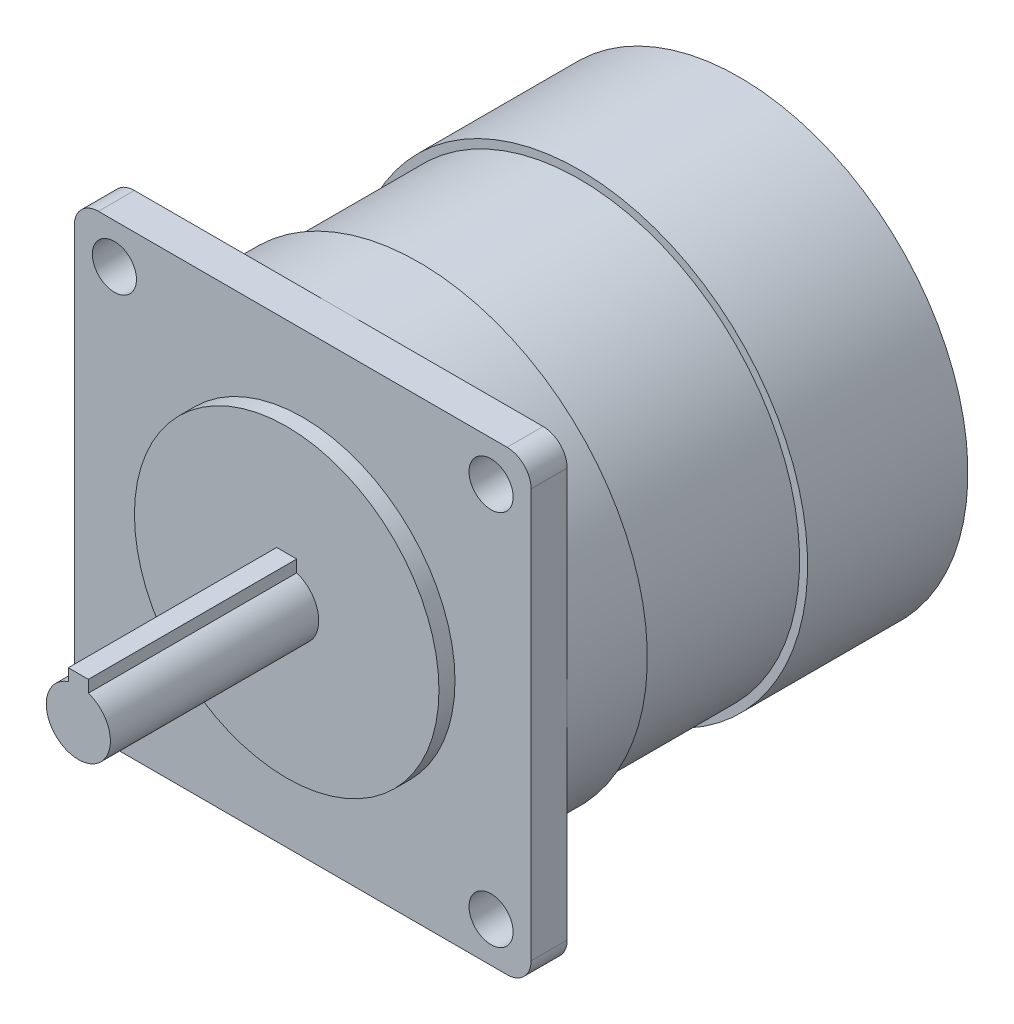
ISO-10303-21;
HEADER;
FILE_DESCRIPTION(('STEP AP214'),'2;1');
FILE_NAME('part.step','',(''),(''),'','','');
FILE_SCHEMA(('AUTOMOTIVE_DESIGN { 1 0 10303 214 1 1 1 1 }'));
ENDSEC;
DATA;
#1=APPLICATION_CONTEXT('core data for automotive mechanical design processes');
#2=APPLICATION_PROTOCOL_DEFINITION('international standard','automotive_design',2000,#1);
#3=PRODUCT_CONTEXT('',#1,'mechanical');
#4=PRODUCT('Part','Part','',(#3));
#5=PRODUCT_RELATED_PRODUCT_CATEGORY('part','',(#4));
#6=PRODUCT_DEFINITION_FORMATION('','',#4);
#7=PRODUCT_DEFINITION_CONTEXT('part definition',#1,'design');
#8=PRODUCT_DEFINITION('design','',#6,#7);
#9=PRODUCT_DEFINITION_SHAPE('','',#8);
#10=(LENGTH_UNIT() NAMED_UNIT(*) SI_UNIT(.MILLI.,.METRE.));
#11=(NAMED_UNIT(*) PLANE_ANGLE_UNIT() SI_UNIT($,.RADIAN.));
#12=(NAMED_UNIT(*) SI_UNIT($,.STERADIAN.) SOLID_ANGLE_UNIT());
#13=UNCERTAINTY_MEASURE_WITH_UNIT(LENGTH_MEASURE(1.E-05),#10,'distance_accuracy_value','');
#14=(GEOMETRIC_REPRESENTATION_CONTEXT(3) GLOBAL_UNCERTAINTY_ASSIGNED_CONTEXT((#13)) GLOBAL_UNIT_ASSIGNED_CONTEXT((#10,
#11,#12)) REPRESENTATION_CONTEXT('',''));
#15=CARTESIAN_POINT('',(0.,0.,0.));
#16=DIRECTION('',(0.,0.,1.));
#17=DIRECTION('',(1.,0.,0.));
#18=AXIS2_PLACEMENT_3D('',#15,#16,#17);
#19=CARTESIAN_POINT('',(0.,0.,0.));
#20=DIRECTION('',(0.,0.,-1.00000000000002));
#21=DIRECTION('',(-1.00000000000002,0.,0.));
#22=AXIS2_PLACEMENT_3D('',#19,#20,#21);
#23=PLANE('',#22);
#24=CARTESIAN_POINT('',(0.,0.,0.));
#25=DIRECTION('',(0.,0.,-1.00000000000002));
#26=DIRECTION('',(-1.00000000000002,0.,0.));
#27=AXIS2_PLACEMENT_3D('',#24,#25,#26);
#28=CIRCLE('',#27,28.5);
#29=CARTESIAN_POINT('',(-28.5,-4.44089209850063E-12,0.));
#30=VERTEX_POINT('',#29);
#31=CARTESIAN_POINT('',(0.,28.5,0.));
#32=VERTEX_POINT('',#31);
#33=EDGE_CURVE('E178',#30,#32,#28,.T.);
#34=ORIENTED_EDGE('',*,*,#33,.F.);
#35=DIRECTION('',(0.,-1.00000000000001,0.));
#36=VECTOR('',#35,1.);
#37=CARTESIAN_POINT('',(-28.5,-28.5000000000044,0.));
#38=LINE('',#37,#36);
#39=CARTESIAN_POINT('',(-28.5,25.4999999999999,3.33066907387547E-13));
#40=VERTEX_POINT('',#39);
#41=EDGE_CURVE('E153',#40,#30,#38,.T.);
#42=ORIENTED_EDGE('',*,*,#41,.F.);
#43=CARTESIAN_POINT('',(-25.5000000000001,25.5000000000001,2.22044604925031E-12));
#44=DIRECTION('',(0.,0.,-1.00000000000002));
#45=DIRECTION('',(-1.00000000000002,0.,0.));
#46=AXIS2_PLACEMENT_3D('',#43,#44,#45);
#47=CIRCLE('',#46,3.);
#48=CARTESIAN_POINT('',(-25.4999999999999,28.5,2.22044604925031E-12));
#49=VERTEX_POINT('',#48);
#50=EDGE_CURVE('E298',#40,#49,#47,.T.);
#51=ORIENTED_EDGE('',*,*,#50,.T.);
#52=DIRECTION('',(-1.00000000000002,0.,0.));
#53=VECTOR('',#52,1.);
#54=CARTESIAN_POINT('',(-28.5,28.5,2.22044604925031E-12));
#55=LINE('',#54,#53);
#56=EDGE_CURVE('E180',#32,#49,#55,.T.);
#57=ORIENTED_EDGE('',*,*,#56,.F.);
#58=EDGE_LOOP('',(#34,#42,#51,#57));
#59=FACE_BOUND('',#58,.T.);
#60=CARTESIAN_POINT('',(-23.5000000000001,23.5000000000003,0.));
#61=DIRECTION('',(0.,0.,-1.00000000000002));
#62=DIRECTION('',(-1.00000000000002,0.,0.));
#63=AXIS2_PLACEMENT_3D('',#60,#61,#62);
#64=CIRCLE('',#63,2.75);
#65=CARTESIAN_POINT('',(-26.2500000000002,23.5000000000003,0.));
#66=VERTEX_POINT('',#65);
#67=EDGE_CURVE('E214',#66,#66,#64,.T.);
#68=ORIENTED_EDGE('',*,*,#67,.F.);
#69=EDGE_LOOP('',(#68));
#70=FACE_BOUND('',#69,.T.);
#71=ADVANCED_FACE('F47',(#59,#70),#23,.T.);
#72=CARTESIAN_POINT('',(28.5,0.,0.));
#73=VERTEX_POINT('',#72);
#74=EDGE_CURVE('E57',#32,#73,#28,.T.);
#75=ORIENTED_EDGE('',*,*,#74,.F.);
#76=CARTESIAN_POINT('',(25.5000000000043,28.5,1.88737914186277E-12));
#77=VERTEX_POINT('',#76);
#78=EDGE_CURVE('E176',#77,#32,#55,.T.);
#79=ORIENTED_EDGE('',*,*,#78,.F.);
#80=CARTESIAN_POINT('',(25.5000000000001,25.4999999999999,0.));
#81=DIRECTION('',(0.,0.,-1.00000000000002));
#82=DIRECTION('',(-1.00000000000002,0.,0.));
#83=AXIS2_PLACEMENT_3D('',#80,#81,#82);
#84=CIRCLE('',#83,3.);
#85=CARTESIAN_POINT('',(28.5,25.4999999999999,0.));
#86=VERTEX_POINT('',#85);
#87=EDGE_CURVE('E301',#77,#86,#84,.T.);
#88=ORIENTED_EDGE('',*,*,#87,.T.);
#89=DIRECTION('',(0.,1.00000000000001,0.));
#90=VECTOR('',#89,1.);
#91=CARTESIAN_POINT('',(28.5000000000044,-28.5000000000044,0.));
#92=LINE('',#91,#90);
#93=EDGE_CURVE('E263',#73,#86,#92,.T.);
#94=ORIENTED_EDGE('',*,*,#93,.F.);
#95=EDGE_LOOP('',(#75,#79,#88,#94));
#96=FACE_BOUND('',#95,.T.);
#97=CARTESIAN_POINT('',(23.5000000000001,23.5000000000001,2.22044604925031E-12));
#98=DIRECTION('',(0.,0.,-1.00000000000002));
#99=DIRECTION('',(-1.00000000000002,0.,0.));
#100=AXIS2_PLACEMENT_3D('',#97,#98,#99);
#101=CIRCLE('',#100,2.75);
#102=CARTESIAN_POINT('',(20.75,23.5000000000001,2.2212093278131E-12));
#103=VERTEX_POINT('',#102);
#104=EDGE_CURVE('E51',#103,#103,#101,.T.);
#105=ORIENTED_EDGE('',*,*,#104,.F.);
#106=EDGE_LOOP('',(#105));
#107=FACE_BOUND('',#106,.T.);
#108=ADVANCED_FACE('F361',(#96,#107),#23,.T.);
#109=CARTESIAN_POINT('',(4.44089209850063E-12,-28.5,0.));
#110=VERTEX_POINT('',#109);
#111=EDGE_CURVE('E65',#73,#110,#28,.T.);
#112=ORIENTED_EDGE('',*,*,#111,.F.);
#113=CARTESIAN_POINT('',(28.5000000000002,-25.5000000000043,0.));
#114=VERTEX_POINT('',#113);
#115=EDGE_CURVE('E283',#114,#73,#92,.T.);
#116=ORIENTED_EDGE('',*,*,#115,.F.);
#117=CARTESIAN_POINT('',(25.5000000000001,-25.5000000000001,0.));
#118=DIRECTION('',(0.,0.,-1.00000000000002));
#119=DIRECTION('',(-1.00000000000002,0.,0.));
#120=AXIS2_PLACEMENT_3D('',#117,#118,#119);
#121=CIRCLE('',#120,3.);
#122=CARTESIAN_POINT('',(25.5000000000043,-28.5,0.));
#123=VERTEX_POINT('',#122);
#124=EDGE_CURVE('E305',#114,#123,#121,.T.);
#125=ORIENTED_EDGE('',*,*,#124,.T.);
#126=DIRECTION('',(1.00000000000002,0.,0.));
#127=VECTOR('',#126,1.);
#128=CARTESIAN_POINT('',(-28.5,-28.5000000000044,0.));
#129=LINE('',#128,#127);
#130=EDGE_CURVE('E165',#110,#123,#129,.T.);
#131=ORIENTED_EDGE('',*,*,#130,.F.);
#132=EDGE_LOOP('',(#112,#116,#125,#131));
#133=FACE_BOUND('',#132,.T.);
#134=CARTESIAN_POINT('',(23.5000000000001,-23.5000000000001,2.22044604925031E-12));
#135=DIRECTION('',(0.,0.,-1.00000000000002));
#136=DIRECTION('',(-1.00000000000002,0.,0.));
#137=AXIS2_PLACEMENT_3D('',#134,#135,#136);
#138=CIRCLE('',#137,2.75);
#139=CARTESIAN_POINT('',(20.75,-23.5000000000001,2.2212093278131E-12));
#140=VERTEX_POINT('',#139);
#141=EDGE_CURVE('E344',#140,#140,#138,.T.);
#142=ORIENTED_EDGE('',*,*,#141,.F.);
#143=EDGE_LOOP('',(#142));
#144=FACE_BOUND('',#143,.T.);
#145=ADVANCED_FACE('F363',(#133,#144),#23,.T.);
#146=CARTESIAN_POINT('',(28.5000000000002,-28.5000000000002,4.49999999999995));
#147=DIRECTION('',(-1.00000000000002,0.,0.));
#148=DIRECTION('',(0.,0.,1.00000000000002));
#149=AXIS2_PLACEMENT_3D('',#146,#147,#148);
#150=PLANE('',#149);
#151=DIRECTION('',(0.,1.00000000000001,0.));
#152=VECTOR('',#151,1.);
#153=CARTESIAN_POINT('',(28.5000000000002,-28.5000000000002,4.49999999999995));
#154=LINE('',#153,#152);
#155=CARTESIAN_POINT('',(28.5,-25.5000000000001,4.49999999999995));
#156=VERTEX_POINT('',#155);
#157=CARTESIAN_POINT('',(28.4999999999995,25.4999999999999,4.49999999999995));
#158=VERTEX_POINT('',#157);
#159=EDGE_CURVE('E265',#156,#158,#154,.T.);
#160=ORIENTED_EDGE('',*,*,#159,.F.);
#161=DIRECTION('',(0.,0.,-1.00000000000002));
#162=VECTOR('',#161,1.);
#163=CARTESIAN_POINT('',(28.5,-25.5000000000001,4.49999999999995));
#164=LINE('',#163,#162);
#165=EDGE_CURVE('E331',#156,#114,#164,.T.);
#166=ORIENTED_EDGE('',*,*,#165,.T.);
#167=ORIENTED_EDGE('',*,*,#115,.T.);
#168=ORIENTED_EDGE('',*,*,#93,.T.);
#169=DIRECTION('',(0.,0.,-1.00000000000002));
#170=VECTOR('',#169,1.);
#171=CARTESIAN_POINT('',(28.4999999999995,25.4999999999999,4.49999999999995));
#172=LINE('',#171,#170);
#173=EDGE_CURVE('E328',#86,#158,#172,.F.);
#174=ORIENTED_EDGE('',*,*,#173,.T.);
#175=EDGE_LOOP('',(#160,#166,#167,#168,#174));
#176=FACE_BOUND('',#175,.T.);
#177=ADVANCED_FACE('F371',(#176),#150,.F.);
#178=CARTESIAN_POINT('',(-28.5,28.5,4.50000000000217));
#179=DIRECTION('',(0.,-1.00000000000001,0.));
#180=DIRECTION('',(0.,0.,-1.00000000000002));
#181=AXIS2_PLACEMENT_3D('',#178,#179,#180);
#182=PLANE('',#181);
#183=DIRECTION('',(-1.00000000000002,0.,0.));
#184=VECTOR('',#183,1.);
#185=CARTESIAN_POINT('',(-28.5,28.5,4.50000000000217));
#186=LINE('',#185,#184);
#187=CARTESIAN_POINT('',(25.5000000000001,28.5,4.50000000000195));
#188=VERTEX_POINT('',#187);
#189=CARTESIAN_POINT('',(-25.4999999999999,28.5000000000002,4.50000000000217));
#190=VERTEX_POINT('',#189);
#191=EDGE_CURVE('E269',#188,#190,#186,.T.);
#192=ORIENTED_EDGE('',*,*,#191,.F.);
#193=DIRECTION('',(0.,0.,-1.00000000000002));
#194=VECTOR('',#193,1.);
#195=CARTESIAN_POINT('',(25.5000000000001,28.5,4.50000000000195));
#196=LINE('',#195,#194);
#197=EDGE_CURVE('E194',#188,#77,#196,.T.);
#198=ORIENTED_EDGE('',*,*,#197,.T.);
#199=ORIENTED_EDGE('',*,*,#78,.T.);
#200=ORIENTED_EDGE('',*,*,#56,.T.);
#201=DIRECTION('',(0.,0.,-1.00000000000002));
#202=VECTOR('',#201,1.);
#203=CARTESIAN_POINT('',(-25.4999999999999,28.5000000000002,4.50000000000217));
#204=LINE('',#203,#202);
#205=EDGE_CURVE('E335',#49,#190,#204,.F.);
#206=ORIENTED_EDGE('',*,*,#205,.T.);
#207=EDGE_LOOP('',(#192,#198,#199,#200,#206));
#208=FACE_BOUND('',#207,.T.);
#209=ADVANCED_FACE('F385',(#208),#182,.F.);
#210=CARTESIAN_POINT('',(-28.5,-28.5000000000002,4.50000000000006));
#211=DIRECTION('',(1.00000000000002,0.,0.));
#212=DIRECTION('',(0.,0.,-1.00000000000002));
#213=AXIS2_PLACEMENT_3D('',#210,#211,#212);
#214=PLANE('',#213);
#215=ORIENTED_EDGE('',*,*,#41,.T.);
#216=CARTESIAN_POINT('',(-28.5,-25.5000000000043,0.));
#217=VERTEX_POINT('',#216);
#218=EDGE_CURVE('E156',#30,#217,#38,.T.);
#219=ORIENTED_EDGE('',*,*,#218,.T.);
#220=DIRECTION('',(0.,0.,-1.00000000000002));
#221=VECTOR('',#220,1.);
#222=CARTESIAN_POINT('',(-28.4999999999999,-25.5000000000001,4.50000000000006));
#223=LINE('',#222,#221);
#224=CARTESIAN_POINT('',(-28.4999999999999,-25.5000000000001,4.50000000000006));
#225=VERTEX_POINT('',#224);
#226=EDGE_CURVE('E313',#217,#225,#223,.F.);
#227=ORIENTED_EDGE('',*,*,#226,.T.);
#228=DIRECTION('',(0.,-1.00000000000001,0.));
#229=VECTOR('',#228,1.);
#230=CARTESIAN_POINT('',(-28.5,-28.5000000000002,4.50000000000006));
#231=LINE('',#230,#229);
#232=CARTESIAN_POINT('',(-28.5,25.4999999999999,4.50000000000028));
#233=VERTEX_POINT('',#232);
#234=EDGE_CURVE('E274',#233,#225,#231,.T.);
#235=ORIENTED_EDGE('',*,*,#234,.F.);
#236=DIRECTION('',(0.,0.,-1.00000000000002));
#237=VECTOR('',#236,1.);
#238=CARTESIAN_POINT('',(-28.5,25.4999999999999,4.50000000000028));
#239=LINE('',#238,#237);
#240=EDGE_CURVE('E160',#233,#40,#239,.T.);
#241=ORIENTED_EDGE('',*,*,#240,.T.);
#242=EDGE_LOOP('',(#215,#219,#227,#235,#241));
#243=FACE_BOUND('',#242,.T.);
#244=ADVANCED_FACE('F155',(#243),#214,.F.);
#245=CARTESIAN_POINT('',(-28.5,-28.5000000000002,4.50000000000006));
#246=DIRECTION('',(0.,1.00000000000001,0.));
#247=DIRECTION('',(0.,0.,1.00000000000002));
#248=AXIS2_PLACEMENT_3D('',#245,#246,#247);
#249=PLANE('',#248);
#250=DIRECTION('',(1.00000000000002,0.,0.));
#251=VECTOR('',#250,1.);
#252=CARTESIAN_POINT('',(-28.5,-28.5000000000002,4.50000000000006));
#253=LINE('',#252,#251);
#254=CARTESIAN_POINT('',(-25.4999999999999,-28.5,4.50000000000217));
#255=VERTEX_POINT('',#254);
#256=CARTESIAN_POINT('',(25.5000000000001,-28.5,4.50000000000006));
#257=VERTEX_POINT('',#256);
#258=EDGE_CURVE('E278',#255,#257,#253,.T.);
#259=ORIENTED_EDGE('',*,*,#258,.F.);
#260=DIRECTION('',(0.,0.,-1.00000000000002));
#261=VECTOR('',#260,1.);
#262=CARTESIAN_POINT('',(-25.4999999999999,-28.5,4.50000000000217));
#263=LINE('',#262,#261);
#264=CARTESIAN_POINT('',(-25.4999999999999,-28.5,2.22044604925031E-12));
#265=VERTEX_POINT('',#264);
#266=EDGE_CURVE('E294',#255,#265,#263,.T.);
#267=ORIENTED_EDGE('',*,*,#266,.T.);
#268=EDGE_CURVE('E270',#265,#110,#129,.T.);
#269=ORIENTED_EDGE('',*,*,#268,.T.);
#270=ORIENTED_EDGE('',*,*,#130,.T.);
#271=DIRECTION('',(0.,0.,-1.00000000000002));
#272=VECTOR('',#271,1.);
#273=CARTESIAN_POINT('',(25.5000000000001,-28.5,4.50000000000006));
#274=LINE('',#273,#272);
#275=EDGE_CURVE('E282',#123,#257,#274,.F.);
#276=ORIENTED_EDGE('',*,*,#275,.T.);
#277=EDGE_LOOP('',(#259,#267,#269,#270,#276));
#278=FACE_BOUND('',#277,.T.);
#279=ADVANCED_FACE('F379',(#278),#249,.F.);
#280=CARTESIAN_POINT('',(0.,0.,4.49999999999995));
#281=DIRECTION('',(0.,0.,-1.00000000000002));
#282=DIRECTION('',(-1.00000000000002,0.,0.));
#283=AXIS2_PLACEMENT_3D('',#280,#281,#282);
#284=PLANE('',#283);
#285=CARTESIAN_POINT('',(23.5,23.5000000000001,4.50000000000217));
#286=DIRECTION('',(0.,0.,1.00000000000002));
#287=DIRECTION('',(1.00000000000002,0.,0.));
#288=AXIS2_PLACEMENT_3D('',#285,#286,#287);
#289=CIRCLE('',#288,2.75);
#290=CARTESIAN_POINT('',(26.2500000000001,23.5000000000001,4.50000000000217));
#291=VERTEX_POINT('',#290);
#292=EDGE_CURVE('E203',#291,#291,#289,.T.);
#293=ORIENTED_EDGE('',*,*,#292,.F.);
#294=EDGE_LOOP('',(#293));
#295=FACE_BOUND('',#294,.T.);
#296=CARTESIAN_POINT('',(-23.5000000000001,-23.4999999999999,4.50000000000006));
#297=DIRECTION('',(0.,0.,1.00000000000002));
#298=DIRECTION('',(1.00000000000002,0.,0.));
#299=AXIS2_PLACEMENT_3D('',#296,#297,#298);
#300=CIRCLE('',#299,2.75);
#301=CARTESIAN_POINT('',(-20.75,-23.4999999999999,4.50000000000006));
#302=VERTEX_POINT('',#301);
#303=EDGE_CURVE('E202',#302,#302,#300,.T.);
#304=ORIENTED_EDGE('',*,*,#303,.F.);
#305=EDGE_LOOP('',(#304));
#306=FACE_BOUND('',#305,.T.);
#307=CARTESIAN_POINT('',(23.5000000000001,-23.5000000000001,4.50000000000217));
#308=DIRECTION('',(0.,0.,1.00000000000002));
#309=DIRECTION('',(1.00000000000002,0.,0.));
#310=AXIS2_PLACEMENT_3D('',#307,#308,#309);
#311=CIRCLE('',#310,2.75);
#312=CARTESIAN_POINT('',(26.2500000000001,-23.5000000000001,4.50000000000217));
#313=VERTEX_POINT('',#312);
#314=EDGE_CURVE('E198',#313,#313,#311,.T.);
#315=ORIENTED_EDGE('',*,*,#314,.F.);
#316=EDGE_LOOP('',(#315));
#317=FACE_BOUND('',#316,.T.);
#318=CARTESIAN_POINT('',(-23.5000000000001,23.5000000000003,4.50000000000006));
#319=DIRECTION('',(0.,0.,1.00000000000002));
#320=DIRECTION('',(1.00000000000002,0.,0.));
#321=AXIS2_PLACEMENT_3D('',#318,#319,#320);
#322=CIRCLE('',#321,2.75);
#323=CARTESIAN_POINT('',(-20.75,23.5000000000003,4.50000000000006));
#324=VERTEX_POINT('',#323);
#325=EDGE_CURVE('E207',#324,#324,#322,.T.);
#326=ORIENTED_EDGE('',*,*,#325,.F.);
#327=EDGE_LOOP('',(#326));
#328=FACE_BOUND('',#327,.T.);
#329=CARTESIAN_POINT('',(0.,0.,4.49999999999995));
#330=DIRECTION('',(0.,0.,1.00000000000002));
#331=DIRECTION('',(1.00000000000002,0.,0.));
#332=AXIS2_PLACEMENT_3D('',#329,#330,#331);
#333=CIRCLE('',#332,19.);
#334=CARTESIAN_POINT('',(19.0000000000004,0.,4.49999999999994));
#335=VERTEX_POINT('',#334);
#336=EDGE_CURVE('E189',#335,#335,#333,.T.);
#337=ORIENTED_EDGE('',*,*,#336,.F.);
#338=EDGE_LOOP('',(#337));
#339=FACE_BOUND('',#338,.T.);
#340=ORIENTED_EDGE('',*,*,#234,.T.);
#341=CARTESIAN_POINT('',(-25.4999999999998,-25.4999999999999,4.50000000000217));
#342=DIRECTION('',(0.,0.,-1.00000000000002));
#343=DIRECTION('',(-1.00000000000002,0.,0.));
#344=AXIS2_PLACEMENT_3D('',#341,#342,#343);
#345=CIRCLE('',#344,3.);
#346=EDGE_CURVE('E325',#225,#255,#345,.F.);
#347=ORIENTED_EDGE('',*,*,#346,.T.);
#348=ORIENTED_EDGE('',*,*,#258,.T.);
#349=CARTESIAN_POINT('',(25.5000000000001,-25.5000000000001,4.50000000000006));
#350=DIRECTION('',(0.,0.,-1.00000000000002));
#351=DIRECTION('',(-1.00000000000002,0.,0.));
#352=AXIS2_PLACEMENT_3D('',#349,#350,#351);
#353=CIRCLE('',#352,3.);
#354=EDGE_CURVE('E322',#257,#156,#353,.F.);
#355=ORIENTED_EDGE('',*,*,#354,.T.);
#356=ORIENTED_EDGE('',*,*,#159,.T.);
#357=CARTESIAN_POINT('',(25.4999999999994,25.5000000000001,4.50000000000006));
#358=DIRECTION('',(0.,0.,-1.00000000000002));
#359=DIRECTION('',(-1.00000000000002,0.,0.));
#360=AXIS2_PLACEMENT_3D('',#357,#358,#359);
#361=CIRCLE('',#360,3.);
#362=EDGE_CURVE('E319',#158,#188,#361,.F.);
#363=ORIENTED_EDGE('',*,*,#362,.T.);
#364=ORIENTED_EDGE('',*,*,#191,.T.);
#365=CARTESIAN_POINT('',(-25.5000000000001,25.5000000000001,4.50000000000217));
#366=DIRECTION('',(0.,0.,-1.00000000000002));
#367=DIRECTION('',(-1.00000000000002,0.,0.));
#368=AXIS2_PLACEMENT_3D('',#365,#366,#367);
#369=CIRCLE('',#368,3.);
#370=EDGE_CURVE('E316',#190,#233,#369,.F.);
#371=ORIENTED_EDGE('',*,*,#370,.T.);
#372=EDGE_LOOP('',(#340,#347,#348,#355,#356,#363,#364,#371));
#373=FACE_BOUND('',#372,.T.);
#374=ADVANCED_FACE('F377',(#295,#306,#317,#328,#339,#373),#284,.F.);
#375=EDGE_CURVE('E172',#110,#30,#28,.T.);
#376=ORIENTED_EDGE('',*,*,#375,.F.);
#377=ORIENTED_EDGE('',*,*,#268,.F.);
#378=CARTESIAN_POINT('',(-25.4999999999999,-25.4999999999999,2.22044604925031E-12));
#379=DIRECTION('',(0.,0.,-1.00000000000002));
#380=DIRECTION('',(-1.00000000000002,0.,0.));
#381=AXIS2_PLACEMENT_3D('',#378,#379,#380);
#382=CIRCLE('',#381,3.);
#383=EDGE_CURVE('E173',#265,#217,#382,.T.);
#384=ORIENTED_EDGE('',*,*,#383,.T.);
#385=ORIENTED_EDGE('',*,*,#218,.F.);
#386=EDGE_LOOP('',(#376,#377,#384,#385));
#387=FACE_BOUND('',#386,.T.);
#388=CARTESIAN_POINT('',(-23.5000000000001,-23.4999999999999,0.));
#389=DIRECTION('',(0.,0.,-1.00000000000002));
#390=DIRECTION('',(-1.00000000000002,0.,0.));
#391=AXIS2_PLACEMENT_3D('',#388,#389,#390);
#392=CIRCLE('',#391,2.75);
#393=CARTESIAN_POINT('',(-26.2500000000002,-23.4999999999999,0.));
#394=VERTEX_POINT('',#393);
#395=EDGE_CURVE('E347',#394,#394,#392,.T.);
#396=ORIENTED_EDGE('',*,*,#395,.F.);
#397=EDGE_LOOP('',(#396));
#398=FACE_BOUND('',#397,.T.);
#399=ADVANCED_FACE('F168',(#387,#398),#23,.T.);
#400=CARTESIAN_POINT('',(-25.4999999999998,-25.4999999999999,4.50000000000217));
#401=DIRECTION('',(0.,0.,-1.00000000000002));
#402=DIRECTION('',(-1.00000000000002,0.,0.));
#403=AXIS2_PLACEMENT_3D('',#400,#401,#402);
#404=CYLINDRICAL_SURFACE('',#403,3.);
#405=ORIENTED_EDGE('',*,*,#346,.F.);
#406=ORIENTED_EDGE('',*,*,#226,.F.);
#407=ORIENTED_EDGE('',*,*,#383,.F.);
#408=ORIENTED_EDGE('',*,*,#266,.F.);
#409=EDGE_LOOP('',(#405,#406,#407,#408));
#410=FACE_BOUND('',#409,.T.);
#411=ADVANCED_FACE('F376',(#410),#404,.T.);
#412=CARTESIAN_POINT('',(25.5000000000001,-25.5000000000001,4.50000000000006));
#413=DIRECTION('',(0.,0.,-1.00000000000002));
#414=DIRECTION('',(-1.00000000000002,0.,0.));
#415=AXIS2_PLACEMENT_3D('',#412,#413,#414);
#416=CYLINDRICAL_SURFACE('',#415,3.);
#417=ORIENTED_EDGE('',*,*,#354,.F.);
#418=ORIENTED_EDGE('',*,*,#275,.F.);
#419=ORIENTED_EDGE('',*,*,#124,.F.);
#420=ORIENTED_EDGE('',*,*,#165,.F.);
#421=EDGE_LOOP('',(#417,#418,#419,#420));
#422=FACE_BOUND('',#421,.T.);
#423=ADVANCED_FACE('F394',(#422),#416,.T.);
#424=CARTESIAN_POINT('',(25.4999999999994,25.5000000000001,4.50000000000006));
#425=DIRECTION('',(0.,0.,-1.00000000000002));
#426=DIRECTION('',(-1.00000000000002,0.,0.));
#427=AXIS2_PLACEMENT_3D('',#424,#425,#426);
#428=CYLINDRICAL_SURFACE('',#427,3.);
#429=ORIENTED_EDGE('',*,*,#362,.F.);
#430=ORIENTED_EDGE('',*,*,#173,.F.);
#431=ORIENTED_EDGE('',*,*,#87,.F.);
#432=ORIENTED_EDGE('',*,*,#197,.F.);
#433=EDGE_LOOP('',(#429,#430,#431,#432));
#434=FACE_BOUND('',#433,.T.);
#435=ADVANCED_FACE('F397',(#434),#428,.T.);
#436=CARTESIAN_POINT('',(-25.5000000000001,25.5000000000001,4.50000000000217));
#437=DIRECTION('',(0.,0.,-1.00000000000002));
#438=DIRECTION('',(-1.00000000000002,0.,0.));
#439=AXIS2_PLACEMENT_3D('',#436,#437,#438);
#440=CYLINDRICAL_SURFACE('',#439,3.);
#441=ORIENTED_EDGE('',*,*,#370,.F.);
#442=ORIENTED_EDGE('',*,*,#205,.F.);
#443=ORIENTED_EDGE('',*,*,#50,.F.);
#444=ORIENTED_EDGE('',*,*,#240,.F.);
#445=EDGE_LOOP('',(#441,#442,#443,#444));
#446=FACE_BOUND('',#445,.T.);
#447=ADVANCED_FACE('F49',(#446),#440,.T.);
#448=CARTESIAN_POINT('',(0.,-4.44089209850063E-12,6.49999999999995));
#449=DIRECTION('',(0.,0.,-1.00000000000002));
#450=DIRECTION('',(-1.00000000000002,0.,0.));
#451=AXIS2_PLACEMENT_3D('',#448,#449,#450);
#452=CYLINDRICAL_SURFACE('',#451,19.);
#453=CARTESIAN_POINT('',(0.,-4.44089209850063E-12,6.49999999999995));
#454=DIRECTION('',(0.,0.,1.00000000000002));
#455=DIRECTION('',(1.00000000000002,0.,0.));
#456=AXIS2_PLACEMENT_3D('',#453,#454,#455);
#457=CIRCLE('',#456,19.);
#458=CARTESIAN_POINT('',(19.0000000000004,-4.43037388868474E-12,6.49999999999994));
#459=VERTEX_POINT('',#458);
#460=EDGE_CURVE('E260',#459,#459,#457,.T.);
#461=ORIENTED_EDGE('',*,*,#460,.F.);
#462=EDGE_LOOP('',(#461));
#463=FACE_BOUND('',#462,.T.);
#464=ORIENTED_EDGE('',*,*,#336,.T.);
#465=EDGE_LOOP('',(#464));
#466=FACE_BOUND('',#465,.T.);
#467=ADVANCED_FACE('F404',(#463,#466),#452,.T.);
#468=CARTESIAN_POINT('',(0.,-4.44089209850063E-12,6.49999999999995));
#469=DIRECTION('',(0.,0.,1.00000000000002));
#470=DIRECTION('',(1.00000000000002,0.,0.));
#471=AXIS2_PLACEMENT_3D('',#468,#469,#470);
#472=PLANE('',#471);
#473=CARTESIAN_POINT('',(0.,-4.44089209850063E-12,6.49999999999995));
#474=DIRECTION('',(0.,0.,1.00000000000002));
#475=DIRECTION('',(1.00000000000002,0.,0.));
#476=AXIS2_PLACEMENT_3D('',#473,#474,#475);
#477=CIRCLE('',#476,4.);
#478=CARTESIAN_POINT('',(-1.25000000000003,3.7996710383883,6.50000000000006));
#479=VERTEX_POINT('',#478);
#480=CARTESIAN_POINT('',(1.24999999999992,3.79967103839252,6.49999999999995));
#481=VERTEX_POINT('',#480);
#482=EDGE_CURVE('E230',#479,#481,#477,.T.);
#483=ORIENTED_EDGE('',*,*,#482,.F.);
#484=DIRECTION('',(0.,-1.00000000000001,0.));
#485=VECTOR('',#484,1.);
#486=CARTESIAN_POINT('',(-1.25000000000003,3.7996710383883,6.50000000000006));
#487=LINE('',#486,#485);
#488=CARTESIAN_POINT('',(-1.24999999999997,5.29967103838813,6.50000000000028));
#489=VERTEX_POINT('',#488);
#490=EDGE_CURVE('E220',#489,#479,#487,.T.);
#491=ORIENTED_EDGE('',*,*,#490,.F.);
#492=DIRECTION('',(-1.00000000000002,0.,0.));
#493=VECTOR('',#492,1.);
#494=CARTESIAN_POINT('',(-1.24999999999997,5.29967103838813,6.50000000000028));
#495=LINE('',#494,#493);
#496=CARTESIAN_POINT('',(1.24999999999997,5.29967103839257,6.49999999999995));
#497=VERTEX_POINT('',#496);
#498=EDGE_CURVE('E238',#497,#489,#495,.T.);
#499=ORIENTED_EDGE('',*,*,#498,.F.);
#500=DIRECTION('',(0.,1.00000000000001,0.));
#501=VECTOR('',#500,1.);
#502=CARTESIAN_POINT('',(1.24999999999997,5.29967103839257,6.49999999999995));
#503=LINE('',#502,#501);
#504=EDGE_CURVE('E234',#481,#497,#503,.T.);
#505=ORIENTED_EDGE('',*,*,#504,.F.);
#506=EDGE_LOOP('',(#483,#491,#499,#505));
#507=FACE_BOUND('',#506,.T.);
#508=ORIENTED_EDGE('',*,*,#460,.T.);
#509=EDGE_LOOP('',(#508));
#510=FACE_BOUND('',#509,.T.);
#511=ADVANCED_FACE('F488',(#507,#510),#472,.T.);
#512=CARTESIAN_POINT('',(0.,-4.44089209850063E-12,32.5));
#513=DIRECTION('',(0.,0.,-1.00000000000002));
#514=DIRECTION('',(-1.00000000000002,0.,0.));
#515=AXIS2_PLACEMENT_3D('',#512,#513,#514);
#516=CYLINDRICAL_SURFACE('',#515,4.);
#517=ORIENTED_EDGE('',*,*,#482,.T.);
#518=DIRECTION('',(0.,0.,-1.00000000000002));
#519=VECTOR('',#518,1.);
#520=CARTESIAN_POINT('',(1.24999999999997,3.79967103839257,32.5));
#521=LINE('',#520,#519);
#522=CARTESIAN_POINT('',(1.24999999999997,3.79967103839257,32.5));
#523=VERTEX_POINT('',#522);
#524=EDGE_CURVE('E256',#523,#481,#521,.T.);
#525=ORIENTED_EDGE('',*,*,#524,.F.);
#526=CARTESIAN_POINT('',(0.,-4.44089209850063E-12,32.5));
#527=DIRECTION('',(0.,0.,1.00000000000002));
#528=DIRECTION('',(1.00000000000002,0.,0.));
#529=AXIS2_PLACEMENT_3D('',#526,#527,#528);
#530=CIRCLE('',#529,4.);
#531=CARTESIAN_POINT('',(-1.24999999999997,3.7996710383883,32.5000000000022));
#532=VERTEX_POINT('',#531);
#533=EDGE_CURVE('E215',#532,#523,#530,.T.);
#534=ORIENTED_EDGE('',*,*,#533,.F.);
#535=DIRECTION('',(0.,0.,-1.00000000000002));
#536=VECTOR('',#535,1.);
#537=CARTESIAN_POINT('',(-1.24999999999997,3.7996710383883,32.5000000000022));
#538=LINE('',#537,#536);
#539=EDGE_CURVE('E229',#532,#479,#538,.T.);
#540=ORIENTED_EDGE('',*,*,#539,.T.);
#541=EDGE_LOOP('',(#517,#525,#534,#540));
#542=FACE_BOUND('',#541,.T.);
#543=ADVANCED_FACE('F493',(#542),#516,.T.);
#544=CARTESIAN_POINT('',(1.24999999999997,5.29967103839263,32.5000000000001));
#545=DIRECTION('',(-1.00000000000002,0.,0.));
#546=DIRECTION('',(0.,0.,1.00000000000002));
#547=AXIS2_PLACEMENT_3D('',#544,#545,#546);
#548=PLANE('',#547);
#549=ORIENTED_EDGE('',*,*,#504,.T.);
#550=DIRECTION('',(0.,0.,-1.00000000000002));
#551=VECTOR('',#550,1.);
#552=CARTESIAN_POINT('',(1.24999999999997,5.29967103839263,32.5000000000001));
#553=LINE('',#552,#551);
#554=CARTESIAN_POINT('',(1.24999999999997,5.29967103839263,32.5000000000001));
#555=VERTEX_POINT('',#554);
#556=EDGE_CURVE('E252',#555,#497,#553,.T.);
#557=ORIENTED_EDGE('',*,*,#556,.F.);
#558=DIRECTION('',(0.,1.00000000000001,0.));
#559=VECTOR('',#558,1.);
#560=CARTESIAN_POINT('',(1.24999999999997,5.29967103839263,32.5000000000001));
#561=LINE('',#560,#559);
#562=EDGE_CURVE('E219',#523,#555,#561,.T.);
#563=ORIENTED_EDGE('',*,*,#562,.F.);
#564=ORIENTED_EDGE('',*,*,#524,.T.);
#565=EDGE_LOOP('',(#549,#557,#563,#564));
#566=FACE_BOUND('',#565,.T.);
#567=ADVANCED_FACE('F500',(#566),#548,.F.);
#568=CARTESIAN_POINT('',(-1.24999999999997,5.29967103838813,32.5000000000022));
#569=DIRECTION('',(0.,-1.00000000000001,0.));
#570=DIRECTION('',(0.,0.,-1.00000000000002));
#571=AXIS2_PLACEMENT_3D('',#568,#569,#570);
#572=PLANE('',#571);
#573=ORIENTED_EDGE('',*,*,#498,.T.);
#574=DIRECTION('',(0.,0.,-1.00000000000002));
#575=VECTOR('',#574,1.);
#576=CARTESIAN_POINT('',(-1.24999999999997,5.29967103838813,32.5000000000022));
#577=LINE('',#576,#575);
#578=CARTESIAN_POINT('',(-1.24999999999997,5.29967103838813,32.5000000000022));
#579=VERTEX_POINT('',#578);
#580=EDGE_CURVE('E248',#579,#489,#577,.T.);
#581=ORIENTED_EDGE('',*,*,#580,.F.);
#582=DIRECTION('',(-1.00000000000002,0.,0.));
#583=VECTOR('',#582,1.);
#584=CARTESIAN_POINT('',(-1.24999999999997,5.29967103838813,32.5000000000022));
#585=LINE('',#584,#583);
#586=EDGE_CURVE('E223',#555,#579,#585,.T.);
#587=ORIENTED_EDGE('',*,*,#586,.F.);
#588=ORIENTED_EDGE('',*,*,#556,.T.);
#589=EDGE_LOOP('',(#573,#581,#587,#588));
#590=FACE_BOUND('',#589,.T.);
#591=ADVANCED_FACE('F504',(#590),#572,.F.);
#592=CARTESIAN_POINT('',(-1.24999999999997,3.7996710383883,32.5000000000022));
#593=DIRECTION('',(1.00000000000002,0.,0.));
#594=DIRECTION('',(0.,0.,-1.00000000000002));
#595=AXIS2_PLACEMENT_3D('',#592,#593,#594);
#596=PLANE('',#595);
#597=ORIENTED_EDGE('',*,*,#490,.T.);
#598=ORIENTED_EDGE('',*,*,#539,.F.);
#599=DIRECTION('',(0.,-1.00000000000001,0.));
#600=VECTOR('',#599,1.);
#601=CARTESIAN_POINT('',(-1.24999999999997,3.7996710383883,32.5000000000022));
#602=LINE('',#601,#600);
#603=EDGE_CURVE('E226',#579,#532,#602,.T.);
#604=ORIENTED_EDGE('',*,*,#603,.F.);
#605=ORIENTED_EDGE('',*,*,#580,.T.);
#606=EDGE_LOOP('',(#597,#598,#604,#605));
#607=FACE_BOUND('',#606,.T.);
#608=ADVANCED_FACE('F508',(#607),#596,.F.);
#609=CARTESIAN_POINT('',(0.,-4.44089209850063E-12,32.5));
#610=DIRECTION('',(0.,0.,1.00000000000002));
#611=DIRECTION('',(1.00000000000002,0.,0.));
#612=AXIS2_PLACEMENT_3D('',#609,#610,#611);
#613=PLANE('',#612);
#614=ORIENTED_EDGE('',*,*,#533,.T.);
#615=ORIENTED_EDGE('',*,*,#562,.T.);
#616=ORIENTED_EDGE('',*,*,#586,.T.);
#617=ORIENTED_EDGE('',*,*,#603,.T.);
#618=EDGE_LOOP('',(#614,#615,#616,#617));
#619=FACE_BOUND('',#618,.T.);
#620=ADVANCED_FACE('F512',(#619),#613,.T.);
#621=CARTESIAN_POINT('',(-23.4999999999962,23.4999999999999,-10.5));
#622=DIRECTION('',(0.,0.,1.00000000000002));
#623=DIRECTION('',(1.00000000000002,0.,0.));
#624=AXIS2_PLACEMENT_3D('',#621,#622,#623);
#625=CYLINDRICAL_SURFACE('',#624,2.75);
#626=ORIENTED_EDGE('',*,*,#67,.T.);
#627=EDGE_LOOP('',(#626));
#628=FACE_BOUND('',#627,.T.);
#629=ORIENTED_EDGE('',*,*,#325,.T.);
#630=EDGE_LOOP('',(#629));
#631=FACE_BOUND('',#630,.T.);
#632=ADVANCED_FACE('F476',(#628,#631),#625,.F.);
#633=CARTESIAN_POINT('',(23.5000000000043,-23.5000000000001,-10.4999999999978));
#634=DIRECTION('',(0.,0.,1.00000000000002));
#635=DIRECTION('',(1.00000000000002,0.,0.));
#636=AXIS2_PLACEMENT_3D('',#633,#634,#635);
#637=CYLINDRICAL_SURFACE('',#636,2.75);
#638=ORIENTED_EDGE('',*,*,#141,.T.);
#639=EDGE_LOOP('',(#638));
#640=FACE_BOUND('',#639,.T.);
#641=ORIENTED_EDGE('',*,*,#314,.T.);
#642=EDGE_LOOP('',(#641));
#643=FACE_BOUND('',#642,.T.);
#644=ADVANCED_FACE('F472',(#640,#643),#637,.F.);
#645=CARTESIAN_POINT('',(-23.4999999999956,-23.5000000000043,-10.5));
#646=DIRECTION('',(0.,0.,1.00000000000002));
#647=DIRECTION('',(1.00000000000002,0.,0.));
#648=AXIS2_PLACEMENT_3D('',#645,#646,#647);
#649=CYLINDRICAL_SURFACE('',#648,2.75);
#650=ORIENTED_EDGE('',*,*,#395,.T.);
#651=EDGE_LOOP('',(#650));
#652=FACE_BOUND('',#651,.T.);
#653=ORIENTED_EDGE('',*,*,#303,.T.);
#654=EDGE_LOOP('',(#653));
#655=FACE_BOUND('',#654,.T.);
#656=ADVANCED_FACE('F475',(#652,#655),#649,.F.);
#657=CARTESIAN_POINT('',(23.5000000000044,23.4999999999999,-10.4999999999978));
#658=DIRECTION('',(0.,0.,1.00000000000002));
#659=DIRECTION('',(1.00000000000002,0.,0.));
#660=AXIS2_PLACEMENT_3D('',#657,#658,#659);
#661=CYLINDRICAL_SURFACE('',#660,2.75);
#662=ORIENTED_EDGE('',*,*,#104,.T.);
#663=EDGE_LOOP('',(#662));
#664=FACE_BOUND('',#663,.T.);
#665=ORIENTED_EDGE('',*,*,#292,.T.);
#666=EDGE_LOOP('',(#665));
#667=FACE_BOUND('',#666,.T.);
#668=ADVANCED_FACE('F358',(#664,#667),#661,.F.);
#669=CARTESIAN_POINT('',(0.,-4.44089209850063E-12,-10.));
#670=DIRECTION('',(0.,0.,1.00000000000002));
#671=DIRECTION('',(1.00000000000002,0.,0.));
#672=AXIS2_PLACEMENT_3D('',#669,#670,#671);
#673=CYLINDRICAL_SURFACE('',#672,28.5);
#674=CARTESIAN_POINT('',(0.,-4.44089209850063E-12,-10.));
#675=DIRECTION('',(0.,0.,-1.00000000000002));
#676=DIRECTION('',(-1.00000000000002,0.,0.));
#677=AXIS2_PLACEMENT_3D('',#674,#675,#676);
#678=CIRCLE('',#677,28.5);
#679=CARTESIAN_POINT('',(-28.5000000000005,-4.45666941322445E-12,-10.));
#680=VERTEX_POINT('',#679);
#681=EDGE_CURVE('E184',#680,#680,#678,.T.);
#682=ORIENTED_EDGE('',*,*,#681,.F.);
#683=EDGE_LOOP('',(#682));
#684=FACE_BOUND('',#683,.T.);
#685=ORIENTED_EDGE('',*,*,#33,.T.);
#686=ORIENTED_EDGE('',*,*,#74,.T.);
#687=ORIENTED_EDGE('',*,*,#111,.T.);
#688=ORIENTED_EDGE('',*,*,#375,.T.);
#689=EDGE_LOOP('',(#685,#686,#687,#688));
#690=FACE_BOUND('',#689,.T.);
#691=ADVANCED_FACE('F187',(#684,#690),#673,.T.);
#692=CARTESIAN_POINT('',(0.,-4.44089209850063E-12,-10.));
#693=DIRECTION('',(0.,0.,-1.00000000000002));
#694=DIRECTION('',(-1.00000000000002,0.,0.));
#695=AXIS2_PLACEMENT_3D('',#692,#693,#694);
#696=PLANE('',#695);
#697=CARTESIAN_POINT('',(0.,-4.44089209850063E-12,-10.));
#698=DIRECTION('',(0.,0.,-1.00000000000002));
#699=DIRECTION('',(-1.00000000000002,0.,0.));
#700=AXIS2_PLACEMENT_3D('',#697,#698,#699);
#701=CIRCLE('',#700,27.5);
#702=CARTESIAN_POINT('',(-27.5000000000004,-4.45611582323414E-12,-10.));
#703=VERTEX_POINT('',#702);
#704=EDGE_CURVE('E11',#703,#703,#701,.T.);
#705=ORIENTED_EDGE('',*,*,#704,.F.);
#706=EDGE_LOOP('',(#705));
#707=FACE_BOUND('',#706,.T.);
#708=ORIENTED_EDGE('',*,*,#681,.T.);
#709=EDGE_LOOP('',(#708));
#710=FACE_BOUND('',#709,.T.);
#711=ADVANCED_FACE('F526',(#707,#710),#696,.T.);
#712=CARTESIAN_POINT('',(0.,0.,-30.));
#713=DIRECTION('',(0.,0.,1.00000000000002));
#714=DIRECTION('',(1.00000000000002,0.,0.));
#715=AXIS2_PLACEMENT_3D('',#712,#713,#714);
#716=CYLINDRICAL_SURFACE('',#715,27.5);
#717=CARTESIAN_POINT('',(0.,0.,-30.));
#718=DIRECTION('',(0.,0.,-1.00000000000002));
#719=DIRECTION('',(-1.00000000000002,0.,0.));
#720=AXIS2_PLACEMENT_3D('',#717,#718,#719);
#721=CIRCLE('',#720,27.5);
#722=CARTESIAN_POINT('',(-27.5000000000005,0.,-30.));
#723=VERTEX_POINT('',#722);
#724=EDGE_CURVE('E185',#723,#723,#721,.T.);
#725=ORIENTED_EDGE('',*,*,#724,.F.);
#726=EDGE_LOOP('',(#725));
#727=FACE_BOUND('',#726,.T.);
#728=ORIENTED_EDGE('',*,*,#704,.T.);
#729=EDGE_LOOP('',(#728));
#730=FACE_BOUND('',#729,.T.);
#731=ADVANCED_FACE('F530',(#727,#730),#716,.T.);
#732=CARTESIAN_POINT('',(0.,2.22044604925031E-13,-50.));
#733=DIRECTION('',(0.,0.,1.00000000000002));
#734=DIRECTION('',(1.00000000000002,0.,0.));
#735=AXIS2_PLACEMENT_3D('',#732,#733,#734);
#736=CYLINDRICAL_SURFACE('',#735,28.5);
#737=CARTESIAN_POINT('',(0.,2.22044604925031E-13,-50.));
#738=DIRECTION('',(0.,0.,-1.00000000000002));
#739=DIRECTION('',(-1.00000000000002,0.,0.));
#740=AXIS2_PLACEMENT_3D('',#737,#738,#739);
#741=CIRCLE('',#740,28.5);
#742=CARTESIAN_POINT('',(-28.5000000000005,2.06267290201206E-13,-50.));
#743=VERTEX_POINT('',#742);
#744=EDGE_CURVE('E550',#743,#743,#741,.T.);
#745=ORIENTED_EDGE('',*,*,#744,.F.);
#746=EDGE_LOOP('',(#745));
#747=FACE_BOUND('',#746,.T.);
#748=CARTESIAN_POINT('',(0.,0.,-30.));
#749=DIRECTION('',(0.,0.,-1.00000000000002));
#750=DIRECTION('',(-1.00000000000002,0.,0.));
#751=AXIS2_PLACEMENT_3D('',#748,#749,#750);
#752=CIRCLE('',#751,28.5);
#753=CARTESIAN_POINT('',(-28.5000000000005,0.,-30.));
#754=VERTEX_POINT('',#753);
#755=EDGE_CURVE('E552',#754,#754,#752,.T.);
#756=ORIENTED_EDGE('',*,*,#755,.T.);
#757=EDGE_LOOP('',(#756));
#758=FACE_BOUND('',#757,.T.);
#759=ADVANCED_FACE('F534',(#747,#758),#736,.T.);
#760=CARTESIAN_POINT('',(0.,2.22044604925031E-13,-50.));
#761=DIRECTION('',(0.,0.,-1.00000000000002));
#762=DIRECTION('',(-1.00000000000002,0.,0.));
#763=AXIS2_PLACEMENT_3D('',#760,#761,#762);
#764=PLANE('',#763);
#765=ORIENTED_EDGE('',*,*,#744,.T.);
#766=EDGE_LOOP('',(#765));
#767=FACE_BOUND('',#766,.T.);
#768=ADVANCED_FACE('F538',(#767),#764,.T.);
#769=CARTESIAN_POINT('',(0.,0.,-30.));
#770=DIRECTION('',(0.,0.,-1.00000000000002));
#771=DIRECTION('',(-1.00000000000002,0.,0.));
#772=AXIS2_PLACEMENT_3D('',#769,#770,#771);
#773=PLANE('',#772);
#774=ORIENTED_EDGE('',*,*,#724,.T.);
#775=EDGE_LOOP('',(#774));
#776=FACE_BOUND('',#775,.T.);
#777=ORIENTED_EDGE('',*,*,#755,.F.);
#778=EDGE_LOOP('',(#777));
#779=FACE_BOUND('',#778,.T.);
#780=ADVANCED_FACE('F540',(#776,#779),#773,.F.);
#781=CLOSED_SHELL('',(#71,#108,#145,#177,#209,#244,#279,#374,#399,#411,#423,#435,#447,#467,#511,
#543,#567,#591,#608,#620,#632,#644,#656,#668,#691,#711,#731,#759,#768,#780));
#782=MANIFOLD_SOLID_BREP('B2',#781);
#783=ADVANCED_BREP_SHAPE_REPRESENTATION('',(#18,#782),#14);
#784=SHAPE_DEFINITION_REPRESENTATION(#9,#783);
ENDSEC;
END-ISO-10303-21;
